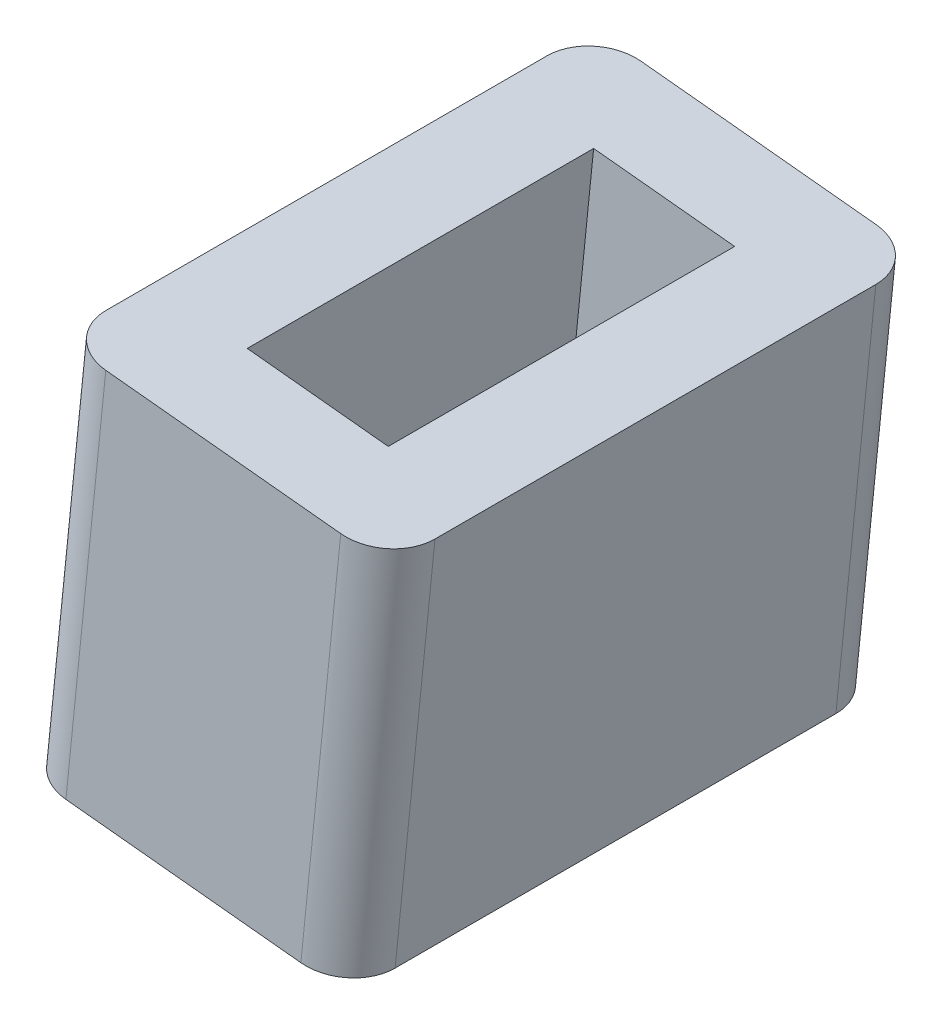
ISO-10303-21;
HEADER;
FILE_DESCRIPTION(('STEP AP214'),'2;1');
FILE_NAME('part.step','',(''),(''),'','','');
FILE_SCHEMA(('AUTOMOTIVE_DESIGN { 1 0 10303 214 1 1 1 1 }'));
ENDSEC;
DATA;
#1=APPLICATION_CONTEXT('core data for automotive mechanical design processes');
#2=APPLICATION_PROTOCOL_DEFINITION('international standard','automotive_design',2000,#1);
#3=PRODUCT_CONTEXT('',#1,'mechanical');
#4=PRODUCT('Part','Part','',(#3));
#5=PRODUCT_RELATED_PRODUCT_CATEGORY('part','',(#4));
#6=PRODUCT_DEFINITION_FORMATION('','',#4);
#7=PRODUCT_DEFINITION_CONTEXT('part definition',#1,'design');
#8=PRODUCT_DEFINITION('design','',#6,#7);
#9=PRODUCT_DEFINITION_SHAPE('','',#8);
#10=(LENGTH_UNIT() NAMED_UNIT(*) SI_UNIT(.MILLI.,.METRE.));
#11=(NAMED_UNIT(*) PLANE_ANGLE_UNIT() SI_UNIT($,.RADIAN.));
#12=(NAMED_UNIT(*) SI_UNIT($,.STERADIAN.) SOLID_ANGLE_UNIT());
#13=UNCERTAINTY_MEASURE_WITH_UNIT(LENGTH_MEASURE(1.E-05),#10,'distance_accuracy_value','');
#14=(GEOMETRIC_REPRESENTATION_CONTEXT(3) GLOBAL_UNCERTAINTY_ASSIGNED_CONTEXT((#13)) GLOBAL_UNIT_ASSIGNED_CONTEXT((#10,
#11,#12)) REPRESENTATION_CONTEXT('',''));
#15=CARTESIAN_POINT('',(0.,0.,0.));
#16=DIRECTION('',(0.,0.,1.));
#17=DIRECTION('',(1.,0.,0.));
#18=AXIS2_PLACEMENT_3D('',#15,#16,#17);
#19=CARTESIAN_POINT('',(-88.2986315957566,-162.727742424135,-14.499999999999));
#20=DIRECTION('',(0.101322253907588,0.994853658013623,0.));
#21=DIRECTION('',(-0.703467767869676,0.0716456528231604,-0.707106781186547));
#22=AXIS2_PLACEMENT_3D('',#19,#20,#21);
#23=CYLINDRICAL_SURFACE('',#22,3.);
#24=CARTESIAN_POINT('',(-94.8779971814716,-227.328614077932,-14.499999999999));
#25=DIRECTION('',(0.101322253907589,0.994853658013623,0.));
#26=DIRECTION('',(-0.703467767869676,0.0716456528231611,-0.707106781186547));
#27=AXIS2_PLACEMENT_3D('',#24,#25,#26);
#28=CIRCLE('',#27,3.);
#29=CARTESIAN_POINT('',(-94.8779971814716,-227.328614077932,-17.499999999999));
#30=VERTEX_POINT('',#29);
#31=CARTESIAN_POINT('',(-97.8625581555124,-227.024647316209,-14.499999999999));
#32=VERTEX_POINT('',#31);
#33=EDGE_CURVE('E11',#30,#32,#28,.T.);
#34=ORIENTED_EDGE('',*,*,#33,.T.);
#35=DIRECTION('',(0.101322253907588,0.994853658013623,0.));
#36=VECTOR('',#35,1.);
#37=CARTESIAN_POINT('',(-91.2831925697974,-162.423775662412,-14.499999999999));
#38=LINE('',#37,#36);
#39=CARTESIAN_POINT('',(-95.3295018078228,-202.153305865869,-14.499999999999));
#40=VERTEX_POINT('',#39);
#41=EDGE_CURVE('E28',#32,#40,#38,.T.);
#42=ORIENTED_EDGE('',*,*,#41,.T.);
#43=CARTESIAN_POINT('',(-92.3449408337819,-202.457272627592,-14.499999999999));
#44=DIRECTION('',(-0.101322253907587,-0.994853658013623,0.));
#45=DIRECTION('',(-0.703467767869676,0.0716456528231603,-0.707106781186547));
#46=AXIS2_PLACEMENT_3D('',#43,#44,#45);
#47=CIRCLE('',#46,3.);
#48=CARTESIAN_POINT('',(-92.3449408337819,-202.457272627592,-17.499999999999));
#49=VERTEX_POINT('',#48);
#50=EDGE_CURVE('E131',#40,#49,#47,.T.);
#51=ORIENTED_EDGE('',*,*,#50,.T.);
#52=DIRECTION('',(-0.101322253907588,-0.994853658013623,0.));
#53=VECTOR('',#52,1.);
#54=CARTESIAN_POINT('',(-88.2986315957566,-162.727742424135,-17.499999999999));
#55=LINE('',#54,#53);
#56=EDGE_CURVE('E104',#49,#30,#55,.T.);
#57=ORIENTED_EDGE('',*,*,#56,.T.);
#58=EDGE_LOOP('',(#34,#42,#51,#57));
#59=FACE_BOUND('',#58,.T.);
#60=ADVANCED_FACE('F17',(#59),#23,.T.);
#61=CARTESIAN_POINT('',(-88.2986315957566,-162.727742424135,13.500000000001));
#62=DIRECTION('',(-0.101322253907588,-0.994853658013623,0.));
#63=DIRECTION('',(-0.703467767869676,0.0716456528231604,0.707106781186547));
#64=AXIS2_PLACEMENT_3D('',#61,#62,#63);
#65=CYLINDRICAL_SURFACE('',#64,3.);
#66=CARTESIAN_POINT('',(-92.3449408337819,-202.457272627592,13.500000000001));
#67=DIRECTION('',(-0.101322253907587,-0.994853658013623,0.));
#68=DIRECTION('',(-0.703467767869676,0.0716456528231603,0.707106781186547));
#69=AXIS2_PLACEMENT_3D('',#66,#67,#68);
#70=CIRCLE('',#69,3.);
#71=CARTESIAN_POINT('',(-92.3449408337819,-202.457272627592,16.500000000001));
#72=VERTEX_POINT('',#71);
#73=CARTESIAN_POINT('',(-95.3295018078228,-202.153305865869,13.500000000001));
#74=VERTEX_POINT('',#73);
#75=EDGE_CURVE('E117',#72,#74,#70,.T.);
#76=ORIENTED_EDGE('',*,*,#75,.T.);
#77=DIRECTION('',(-0.101322253907588,-0.994853658013623,0.));
#78=VECTOR('',#77,1.);
#79=CARTESIAN_POINT('',(-91.2831925697974,-162.423775662412,13.500000000001));
#80=LINE('',#79,#78);
#81=CARTESIAN_POINT('',(-97.8625581555124,-227.024647316209,13.500000000001));
#82=VERTEX_POINT('',#81);
#83=EDGE_CURVE('E108',#74,#82,#80,.T.);
#84=ORIENTED_EDGE('',*,*,#83,.T.);
#85=CARTESIAN_POINT('',(-94.8779971814716,-227.328614077932,13.500000000001));
#86=DIRECTION('',(0.101322253907589,0.994853658013623,0.));
#87=DIRECTION('',(-0.703467767869676,0.0716456528231611,0.707106781186547));
#88=AXIS2_PLACEMENT_3D('',#85,#86,#87);
#89=CIRCLE('',#88,3.);
#90=CARTESIAN_POINT('',(-94.8779971814716,-227.328614077932,16.500000000001));
#91=VERTEX_POINT('',#90);
#92=EDGE_CURVE('E118',#82,#91,#89,.T.);
#93=ORIENTED_EDGE('',*,*,#92,.T.);
#94=DIRECTION('',(0.101322253907588,0.994853658013623,0.));
#95=VECTOR('',#94,1.);
#96=CARTESIAN_POINT('',(-88.2986315957566,-162.727742424135,16.500000000001));
#97=LINE('',#96,#95);
#98=EDGE_CURVE('E123',#91,#72,#97,.T.);
#99=ORIENTED_EDGE('',*,*,#98,.T.);
#100=EDGE_LOOP('',(#76,#84,#93,#99));
#101=FACE_BOUND('',#100,.T.);
#102=ADVANCED_FACE('F122',(#101),#65,.T.);
#103=CARTESIAN_POINT('',(-96.5960299816676,-214.588976591039,10.000000000001));
#104=DIRECTION('',(-0.994853658013623,0.101322253907588,0.));
#105=DIRECTION('',(0.101322253907588,0.994853658013623,0.));
#106=AXIS2_PLACEMENT_3D('',#103,#104,#105);
#107=PLANE('',#106);
#108=ORIENTED_EDGE('',*,*,#41,.F.);
#109=DIRECTION('',(0.,0.,-1.));
#110=VECTOR('',#109,1.);
#111=CARTESIAN_POINT('',(-97.8625581555124,-227.024647316209,10.000000000001));
#112=LINE('',#111,#110);
#113=EDGE_CURVE('E113',#82,#32,#112,.T.);
#114=ORIENTED_EDGE('',*,*,#113,.F.);
#115=ORIENTED_EDGE('',*,*,#83,.F.);
#116=DIRECTION('',(0.,0.,-1.));
#117=VECTOR('',#116,1.);
#118=CARTESIAN_POINT('',(-95.3295018078228,-202.153305865869,10.000000000001));
#119=LINE('',#118,#117);
#120=EDGE_CURVE('E111',#74,#40,#119,.T.);
#121=ORIENTED_EDGE('',*,*,#120,.T.);
#122=EDGE_LOOP('',(#108,#114,#115,#121));
#123=FACE_BOUND('',#122,.T.);
#124=ADVANCED_FACE('F19',(#123),#107,.T.);
#125=CARTESIAN_POINT('',(-87.4165947463481,-228.088530982241,10.000000000001));
#126=DIRECTION('',(-0.101322253907589,-0.994853658013623,0.));
#127=DIRECTION('',(-0.994853658013623,0.101322253907589,0.));
#128=AXIS2_PLACEMENT_3D('',#125,#126,#127);
#129=PLANE('',#128);
#130=DIRECTION('',(0.,0.,-1.));
#131=VECTOR('',#130,1.);
#132=CARTESIAN_POINT('',(-91.8950809646616,-227.632413327068,4.50000000000102));
#133=LINE('',#132,#131);
#134=CARTESIAN_POINT('',(-91.8950809646616,-227.632413327068,10.500000000001));
#135=VERTEX_POINT('',#134);
#136=CARTESIAN_POINT('',(-91.8950809646616,-227.632413327068,-11.499999999999));
#137=VERTEX_POINT('',#136);
#138=EDGE_CURVE('E188',#135,#137,#133,.T.);
#139=ORIENTED_EDGE('',*,*,#138,.F.);
#140=DIRECTION('',(-0.994853658013623,0.101322253907589,0.));
#141=VECTOR('',#140,1.);
#142=CARTESIAN_POINT('',(-87.4165947462925,-228.088530982247,10.500000000001));
#143=LINE('',#142,#141);
#144=CARTESIAN_POINT('',(-82.9381085278122,-228.544648637437,10.500000000001));
#145=VERTEX_POINT('',#144);
#146=EDGE_CURVE('E146',#145,#135,#143,.T.);
#147=ORIENTED_EDGE('',*,*,#146,.F.);
#148=DIRECTION('',(0.,0.,1.));
#149=VECTOR('',#148,1.);
#150=CARTESIAN_POINT('',(-82.9381085278122,-228.544648637437,4.50000000000102));
#151=LINE('',#150,#149);
#152=CARTESIAN_POINT('',(-82.9381085278122,-228.544648637437,-11.499999999999));
#153=VERTEX_POINT('',#152);
#154=EDGE_CURVE('E168',#153,#145,#151,.T.);
#155=ORIENTED_EDGE('',*,*,#154,.F.);
#156=DIRECTION('',(0.994853658013623,-0.101322253907589,0.));
#157=VECTOR('',#156,1.);
#158=CARTESIAN_POINT('',(-87.4165947462925,-228.088530982247,-11.499999999999));
#159=LINE('',#158,#157);
#160=EDGE_CURVE('E163',#137,#153,#159,.T.);
#161=ORIENTED_EDGE('',*,*,#160,.F.);
#162=EDGE_LOOP('',(#139,#147,#155,#161));
#163=FACE_BOUND('',#162,.T.);
#164=ORIENTED_EDGE('',*,*,#33,.F.);
#165=DIRECTION('',(0.994853658013623,-0.101322253907589,0.));
#166=VECTOR('',#165,1.);
#167=CARTESIAN_POINT('',(-87.4165947458982,-228.088530982287,-17.499999999999));
#168=LINE('',#167,#166);
#169=CARTESIAN_POINT('',(-79.9551923112246,-228.84844788655,-17.499999999999));
#170=VERTEX_POINT('',#169);
#171=EDGE_CURVE('E133',#30,#170,#168,.T.);
#172=ORIENTED_EDGE('',*,*,#171,.T.);
#173=CARTESIAN_POINT('',(-79.9551923112246,-228.84844788655,-14.499999999999));
#174=DIRECTION('',(0.101322253907589,0.994853658013623,0.));
#175=DIRECTION('',(0.703467767869676,-0.0716456528231611,-0.707106781186547));
#176=AXIS2_PLACEMENT_3D('',#173,#174,#175);
#177=CIRCLE('',#176,3.);
#178=CARTESIAN_POINT('',(-76.9706313371837,-229.152414648273,-14.499999999999));
#179=VERTEX_POINT('',#178);
#180=EDGE_CURVE('E152',#179,#170,#177,.T.);
#181=ORIENTED_EDGE('',*,*,#180,.F.);
#182=DIRECTION('',(0.,0.,-1.));
#183=VECTOR('',#182,1.);
#184=CARTESIAN_POINT('',(-76.9706313371837,-229.152414648273,10.000000000001));
#185=LINE('',#184,#183);
#186=CARTESIAN_POINT('',(-76.9706313371837,-229.152414648273,13.500000000001));
#187=VERTEX_POINT('',#186);
#188=EDGE_CURVE('E156',#187,#179,#185,.T.);
#189=ORIENTED_EDGE('',*,*,#188,.F.);
#190=CARTESIAN_POINT('',(-79.9551923112246,-228.84844788655,13.500000000001));
#191=DIRECTION('',(0.101322253907589,0.994853658013623,0.));
#192=DIRECTION('',(0.703467767869675,-0.071645652823161,0.707106781186547));
#193=AXIS2_PLACEMENT_3D('',#190,#191,#192);
#194=CIRCLE('',#193,3.);
#195=CARTESIAN_POINT('',(-79.9551923112246,-228.84844788655,16.500000000001));
#196=VERTEX_POINT('',#195);
#197=EDGE_CURVE('E78',#196,#187,#194,.T.);
#198=ORIENTED_EDGE('',*,*,#197,.F.);
#199=DIRECTION('',(-0.994853658013623,0.101322253907589,0.));
#200=VECTOR('',#199,1.);
#201=CARTESIAN_POINT('',(-87.4165947458982,-228.088530982287,16.500000000001));
#202=LINE('',#201,#200);
#203=EDGE_CURVE('E142',#196,#91,#202,.T.);
#204=ORIENTED_EDGE('',*,*,#203,.T.);
#205=ORIENTED_EDGE('',*,*,#92,.F.);
#206=ORIENTED_EDGE('',*,*,#113,.T.);
#207=EDGE_LOOP('',(#164,#172,#181,#189,#198,#204,#205,#206));
#208=FACE_BOUND('',#207,.T.);
#209=ADVANCED_FACE('F251',(#163,#208),#129,.T.);
#210=CARTESIAN_POINT('',(-84.8835383986584,-203.217189531901,10.000000000001));
#211=DIRECTION('',(0.101322253907587,0.994853658013623,0.));
#212=DIRECTION('',(0.994853658013623,-0.101322253907587,0.));
#213=AXIS2_PLACEMENT_3D('',#210,#211,#212);
#214=PLANE('',#213);
#215=ORIENTED_EDGE('',*,*,#50,.F.);
#216=ORIENTED_EDGE('',*,*,#120,.F.);
#217=ORIENTED_EDGE('',*,*,#75,.F.);
#218=DIRECTION('',(0.994853658013623,-0.101322253907587,0.));
#219=VECTOR('',#218,1.);
#220=CARTESIAN_POINT('',(-84.8835383982084,-203.217189531946,16.500000000001));
#221=LINE('',#220,#219);
#222=CARTESIAN_POINT('',(-77.4221359635349,-203.97710643621,16.500000000001));
#223=VERTEX_POINT('',#222);
#224=EDGE_CURVE('E199',#72,#223,#221,.T.);
#225=ORIENTED_EDGE('',*,*,#224,.T.);
#226=CARTESIAN_POINT('',(-77.4221359635349,-203.97710643621,13.500000000001));
#227=DIRECTION('',(-0.101322253907587,-0.994853658013623,0.));
#228=DIRECTION('',(0.703467767869675,-0.0716456528231603,0.707106781186547));
#229=AXIS2_PLACEMENT_3D('',#226,#227,#228);
#230=CIRCLE('',#229,3.);
#231=CARTESIAN_POINT('',(-74.4375749894941,-204.281073197932,13.500000000001));
#232=VERTEX_POINT('',#231);
#233=EDGE_CURVE('E86',#232,#223,#230,.T.);
#234=ORIENTED_EDGE('',*,*,#233,.F.);
#235=DIRECTION('',(0.,0.,-1.));
#236=VECTOR('',#235,1.);
#237=CARTESIAN_POINT('',(-74.4375749894941,-204.281073197932,10.000000000001));
#238=LINE('',#237,#236);
#239=CARTESIAN_POINT('',(-74.4375749894941,-204.281073197932,-14.499999999999));
#240=VERTEX_POINT('',#239);
#241=EDGE_CURVE('E198',#232,#240,#238,.T.);
#242=ORIENTED_EDGE('',*,*,#241,.T.);
#243=CARTESIAN_POINT('',(-77.4221359635349,-203.97710643621,-14.499999999999));
#244=DIRECTION('',(-0.101322253907587,-0.994853658013623,0.));
#245=DIRECTION('',(0.703467767869676,-0.0716456528231603,-0.707106781186547));
#246=AXIS2_PLACEMENT_3D('',#243,#244,#245);
#247=CIRCLE('',#246,3.);
#248=CARTESIAN_POINT('',(-77.4221359635349,-203.97710643621,-17.499999999999));
#249=VERTEX_POINT('',#248);
#250=EDGE_CURVE('E21',#249,#240,#247,.T.);
#251=ORIENTED_EDGE('',*,*,#250,.F.);
#252=DIRECTION('',(-0.994853658013623,0.101322253907587,0.));
#253=VECTOR('',#252,1.);
#254=CARTESIAN_POINT('',(-84.8835383982084,-203.217189531946,-17.499999999999));
#255=LINE('',#254,#253);
#256=EDGE_CURVE('E182',#249,#49,#255,.T.);
#257=ORIENTED_EDGE('',*,*,#256,.T.);
#258=EDGE_LOOP('',(#215,#216,#217,#225,#234,#242,#251,#257));
#259=FACE_BOUND('',#258,.T.);
#260=DIRECTION('',(-0.994853658013623,0.101322253907588,0.));
#261=VECTOR('',#260,1.);
#262=CARTESIAN_POINT('',(-80.9024790091293,-203.622646060143,10.500000000001));
#263=LINE('',#262,#261);
#264=CARTESIAN_POINT('',(-80.4050521801225,-203.673307187096,10.500000000001));
#265=VERTEX_POINT('',#264);
#266=CARTESIAN_POINT('',(-89.362024616972,-202.761071876727,10.500000000001));
#267=VERTEX_POINT('',#266);
#268=EDGE_CURVE('E179',#265,#267,#263,.T.);
#269=ORIENTED_EDGE('',*,*,#268,.T.);
#270=DIRECTION('',(0.,0.,-1.));
#271=VECTOR('',#270,1.);
#272=CARTESIAN_POINT('',(-89.362024616972,-202.761071876727,10.000000000001));
#273=LINE('',#272,#271);
#274=CARTESIAN_POINT('',(-89.362024616972,-202.761071876727,-11.499999999999));
#275=VERTEX_POINT('',#274);
#276=EDGE_CURVE('E183',#267,#275,#273,.T.);
#277=ORIENTED_EDGE('',*,*,#276,.T.);
#278=DIRECTION('',(0.994853658013623,-0.101322253907587,0.));
#279=VECTOR('',#278,1.);
#280=CARTESIAN_POINT('',(-84.8835383986028,-203.217189531906,-11.499999999999));
#281=LINE('',#280,#279);
#282=CARTESIAN_POINT('',(-80.4050521801225,-203.673307187096,-11.499999999999));
#283=VERTEX_POINT('',#282);
#284=EDGE_CURVE('E178',#275,#283,#281,.T.);
#285=ORIENTED_EDGE('',*,*,#284,.T.);
#286=DIRECTION('',(0.,0.,1.));
#287=VECTOR('',#286,1.);
#288=CARTESIAN_POINT('',(-80.4050521801225,-203.673307187096,-11.999999999999));
#289=LINE('',#288,#287);
#290=EDGE_CURVE('E174',#283,#265,#289,.T.);
#291=ORIENTED_EDGE('',*,*,#290,.T.);
#292=EDGE_LOOP('',(#269,#277,#285,#291));
#293=FACE_BOUND('',#292,.T.);
#294=ADVANCED_FACE('F128',(#259,#293),#214,.T.);
#295=CARTESIAN_POINT('',(-75.524391747863,-111.322458399909,16.500000000001));
#296=DIRECTION('',(0.,0.,1.));
#297=DIRECTION('',(1.,0.,0.));
#298=AXIS2_PLACEMENT_3D('',#295,#296,#297);
#299=PLANE('',#298);
#300=ORIENTED_EDGE('',*,*,#98,.F.);
#301=ORIENTED_EDGE('',*,*,#203,.F.);
#302=DIRECTION('',(-0.101322253907588,-0.994853658013623,0.));
#303=VECTOR('',#302,1.);
#304=CARTESIAN_POINT('',(-73.3758267255096,-164.247576232753,16.500000000001));
#305=LINE('',#304,#303);
#306=EDGE_CURVE('E193',#223,#196,#305,.T.);
#307=ORIENTED_EDGE('',*,*,#306,.F.);
#308=ORIENTED_EDGE('',*,*,#224,.F.);
#309=EDGE_LOOP('',(#300,#301,#307,#308));
#310=FACE_BOUND('',#309,.T.);
#311=ADVANCED_FACE('F267',(#310),#299,.T.);
#312=CARTESIAN_POINT('',(-75.524391747863,-111.322458399909,-17.499999999999));
#313=DIRECTION('',(0.,0.,1.));
#314=DIRECTION('',(1.,0.,0.));
#315=AXIS2_PLACEMENT_3D('',#312,#313,#314);
#316=PLANE('',#315);
#317=ORIENTED_EDGE('',*,*,#56,.F.);
#318=ORIENTED_EDGE('',*,*,#256,.F.);
#319=DIRECTION('',(0.101322253907588,0.994853658013623,0.));
#320=VECTOR('',#319,1.);
#321=CARTESIAN_POINT('',(-73.3758267255096,-164.247576232753,-17.499999999999));
#322=LINE('',#321,#320);
#323=EDGE_CURVE('E148',#170,#249,#322,.T.);
#324=ORIENTED_EDGE('',*,*,#323,.F.);
#325=ORIENTED_EDGE('',*,*,#171,.F.);
#326=EDGE_LOOP('',(#317,#318,#324,#325));
#327=FACE_BOUND('',#326,.T.);
#328=ADVANCED_FACE('F280',(#327),#316,.F.);
#329=CARTESIAN_POINT('',(-73.3758267255096,-164.247576232753,-14.499999999999));
#330=DIRECTION('',(-0.101322253907588,-0.994853658013623,0.));
#331=DIRECTION('',(0.703467767869676,-0.0716456528231604,-0.707106781186547));
#332=AXIS2_PLACEMENT_3D('',#329,#330,#331);
#333=CYLINDRICAL_SURFACE('',#332,3.);
#334=ORIENTED_EDGE('',*,*,#250,.T.);
#335=DIRECTION('',(-0.101322253907588,-0.994853658013623,0.));
#336=VECTOR('',#335,1.);
#337=CARTESIAN_POINT('',(-70.3912657514688,-164.551542994476,-14.499999999999));
#338=LINE('',#337,#336);
#339=EDGE_CURVE('E164',#240,#179,#338,.T.);
#340=ORIENTED_EDGE('',*,*,#339,.T.);
#341=ORIENTED_EDGE('',*,*,#180,.T.);
#342=ORIENTED_EDGE('',*,*,#323,.T.);
#343=EDGE_LOOP('',(#334,#340,#341,#342));
#344=FACE_BOUND('',#343,.T.);
#345=ADVANCED_FACE('F281',(#344),#333,.T.);
#346=CARTESIAN_POINT('',(-73.3758267255096,-164.247576232753,13.500000000001));
#347=DIRECTION('',(-0.101322253907588,-0.994853658013623,0.));
#348=DIRECTION('',(0.703467767869675,-0.0716456528231603,0.707106781186547));
#349=AXIS2_PLACEMENT_3D('',#346,#347,#348);
#350=CYLINDRICAL_SURFACE('',#349,3.);
#351=ORIENTED_EDGE('',*,*,#233,.T.);
#352=ORIENTED_EDGE('',*,*,#306,.T.);
#353=ORIENTED_EDGE('',*,*,#197,.T.);
#354=DIRECTION('',(0.101322253907588,0.994853658013623,0.));
#355=VECTOR('',#354,1.);
#356=CARTESIAN_POINT('',(-70.3912657514688,-164.551542994476,13.500000000001));
#357=LINE('',#356,#355);
#358=EDGE_CURVE('E153',#187,#232,#357,.T.);
#359=ORIENTED_EDGE('',*,*,#358,.T.);
#360=EDGE_LOOP('',(#351,#352,#353,#359));
#361=FACE_BOUND('',#360,.T.);
#362=ADVANCED_FACE('F268',(#361),#350,.T.);
#363=CARTESIAN_POINT('',(-75.7041031633389,-216.716743923103,10.000000000001));
#364=DIRECTION('',(0.994853658013623,-0.101322253907588,0.));
#365=DIRECTION('',(-0.101322253907588,-0.994853658013623,0.));
#366=AXIS2_PLACEMENT_3D('',#363,#364,#365);
#367=PLANE('',#366);
#368=ORIENTED_EDGE('',*,*,#339,.F.);
#369=ORIENTED_EDGE('',*,*,#241,.F.);
#370=ORIENTED_EDGE('',*,*,#358,.F.);
#371=ORIENTED_EDGE('',*,*,#188,.T.);
#372=EDGE_LOOP('',(#368,#369,#370,#371));
#373=FACE_BOUND('',#372,.T.);
#374=ADVANCED_FACE('F273',(#373),#367,.T.);
#375=CARTESIAN_POINT('',(-89.362024616972,-202.761071876727,-0.999999999998976));
#376=DIRECTION('',(0.994853658013623,-0.101322253907587,0.));
#377=DIRECTION('',(0.,0.,-1.));
#378=AXIS2_PLACEMENT_3D('',#375,#376,#377);
#379=PLANE('',#378);
#380=ORIENTED_EDGE('',*,*,#138,.T.);
#381=DIRECTION('',(-0.101322253907587,-0.994853658013623,0.));
#382=VECTOR('',#381,1.);
#383=CARTESIAN_POINT('',(-89.362024616972,-202.761071876727,-11.499999999999));
#384=LINE('',#383,#382);
#385=EDGE_CURVE('E159',#275,#137,#384,.T.);
#386=ORIENTED_EDGE('',*,*,#385,.F.);
#387=ORIENTED_EDGE('',*,*,#276,.F.);
#388=DIRECTION('',(-0.101322253907587,-0.994853658013623,0.));
#389=VECTOR('',#388,1.);
#390=CARTESIAN_POINT('',(-89.362024616972,-202.761071876727,10.500000000001));
#391=LINE('',#390,#389);
#392=EDGE_CURVE('E172',#267,#135,#391,.T.);
#393=ORIENTED_EDGE('',*,*,#392,.T.);
#394=EDGE_LOOP('',(#380,#386,#387,#393));
#395=FACE_BOUND('',#394,.T.);
#396=ADVANCED_FACE('F246',(#395),#379,.T.);
#397=CARTESIAN_POINT('',(-80.4050521801225,-203.673307187096,-0.999999999998976));
#398=DIRECTION('',(-0.994853658013623,0.101322253907587,0.));
#399=DIRECTION('',(0.,0.,1.));
#400=AXIS2_PLACEMENT_3D('',#397,#398,#399);
#401=PLANE('',#400);
#402=ORIENTED_EDGE('',*,*,#154,.T.);
#403=DIRECTION('',(-0.101322253907587,-0.994853658013623,0.));
#404=VECTOR('',#403,1.);
#405=CARTESIAN_POINT('',(-80.4050521801225,-203.673307187096,10.500000000001));
#406=LINE('',#405,#404);
#407=EDGE_CURVE('E205',#265,#145,#406,.T.);
#408=ORIENTED_EDGE('',*,*,#407,.F.);
#409=ORIENTED_EDGE('',*,*,#290,.F.);
#410=DIRECTION('',(-0.101322253907587,-0.994853658013623,0.));
#411=VECTOR('',#410,1.);
#412=CARTESIAN_POINT('',(-80.4050521801225,-203.673307187096,-11.499999999999));
#413=LINE('',#412,#411);
#414=EDGE_CURVE('E173',#283,#153,#413,.T.);
#415=ORIENTED_EDGE('',*,*,#414,.T.);
#416=EDGE_LOOP('',(#402,#408,#409,#415));
#417=FACE_BOUND('',#416,.T.);
#418=ADVANCED_FACE('F239',(#417),#401,.T.);
#419=CARTESIAN_POINT('',(-84.8835383985472,-203.217189531912,-11.499999999999));
#420=DIRECTION('',(0.,0.,1.));
#421=DIRECTION('',(1.,0.,0.));
#422=AXIS2_PLACEMENT_3D('',#419,#420,#421);
#423=PLANE('',#422);
#424=ORIENTED_EDGE('',*,*,#160,.T.);
#425=ORIENTED_EDGE('',*,*,#414,.F.);
#426=ORIENTED_EDGE('',*,*,#284,.F.);
#427=ORIENTED_EDGE('',*,*,#385,.T.);
#428=EDGE_LOOP('',(#424,#425,#426,#427));
#429=FACE_BOUND('',#428,.T.);
#430=ADVANCED_FACE('F235',(#429),#423,.T.);
#431=CARTESIAN_POINT('',(-84.8835383985472,-203.217189531912,10.500000000001));
#432=DIRECTION('',(0.,0.,-1.));
#433=DIRECTION('',(-1.,0.,0.));
#434=AXIS2_PLACEMENT_3D('',#431,#432,#433);
#435=PLANE('',#434);
#436=ORIENTED_EDGE('',*,*,#146,.T.);
#437=ORIENTED_EDGE('',*,*,#392,.F.);
#438=ORIENTED_EDGE('',*,*,#268,.F.);
#439=ORIENTED_EDGE('',*,*,#407,.T.);
#440=EDGE_LOOP('',(#436,#437,#438,#439));
#441=FACE_BOUND('',#440,.T.);
#442=ADVANCED_FACE('F242',(#441),#435,.T.);
#443=CLOSED_SHELL('',(#60,#102,#124,#209,#294,#311,#328,#345,#362,#374,#396,#418,#430,#442));
#444=MANIFOLD_SOLID_BREP('B1',#443);
#445=ADVANCED_BREP_SHAPE_REPRESENTATION('',(#18,#444),#14);
#446=SHAPE_DEFINITION_REPRESENTATION(#9,#445);
ENDSEC;
END-ISO-10303-21;
